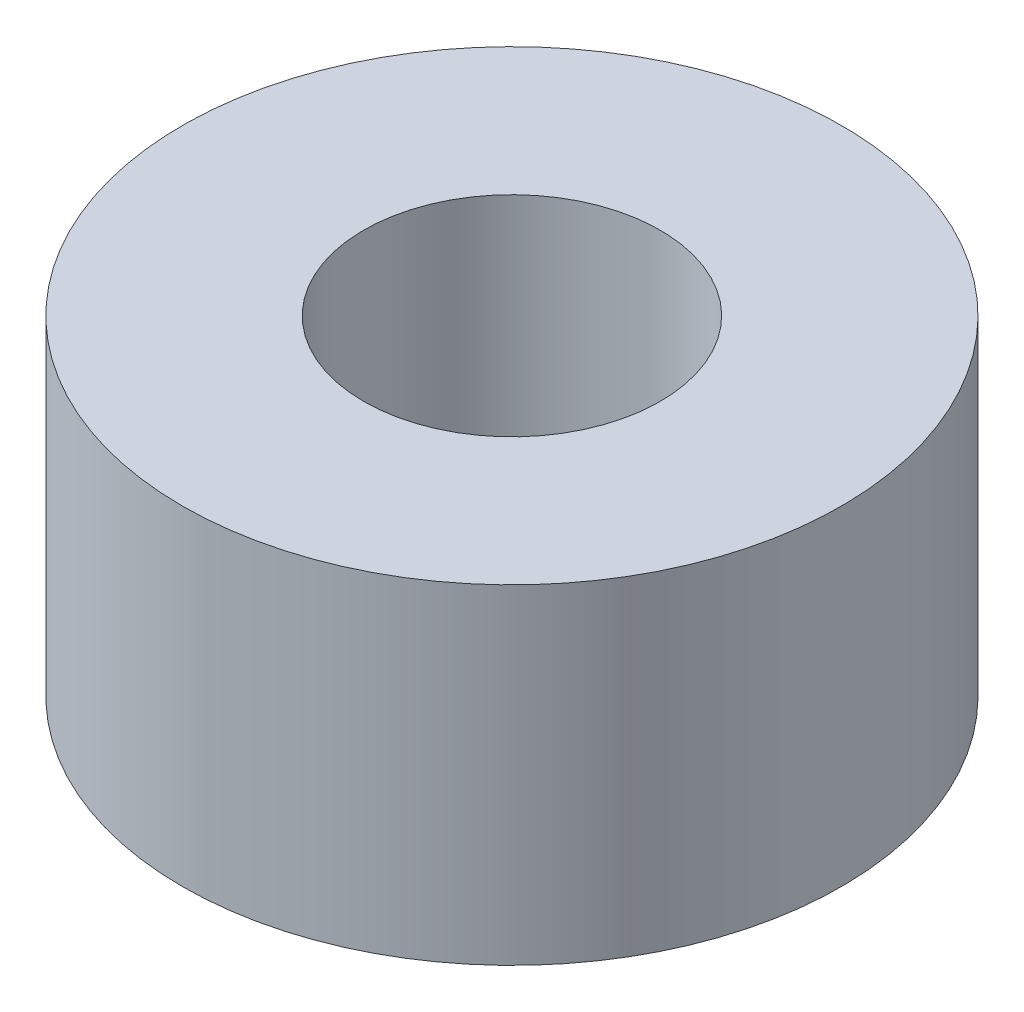
ISO-10303-21;
HEADER;
FILE_DESCRIPTION(('STEP AP214'),'2;1');
FILE_NAME('part.step','',(''),(''),'','','');
FILE_SCHEMA(('AUTOMOTIVE_DESIGN { 1 0 10303 214 1 1 1 1 }'));
ENDSEC;
DATA;
#1=APPLICATION_CONTEXT('core data for automotive mechanical design processes');
#2=APPLICATION_PROTOCOL_DEFINITION('international standard','automotive_design',2000,#1);
#3=PRODUCT_CONTEXT('',#1,'mechanical');
#4=PRODUCT('Part','Part','',(#3));
#5=PRODUCT_RELATED_PRODUCT_CATEGORY('part','',(#4));
#6=PRODUCT_DEFINITION_FORMATION('','',#4);
#7=PRODUCT_DEFINITION_CONTEXT('part definition',#1,'design');
#8=PRODUCT_DEFINITION('design','',#6,#7);
#9=PRODUCT_DEFINITION_SHAPE('','',#8);
#10=(LENGTH_UNIT() NAMED_UNIT(*) SI_UNIT(.MILLI.,.METRE.));
#11=(NAMED_UNIT(*) PLANE_ANGLE_UNIT() SI_UNIT($,.RADIAN.));
#12=(NAMED_UNIT(*) SI_UNIT($,.STERADIAN.) SOLID_ANGLE_UNIT());
#13=UNCERTAINTY_MEASURE_WITH_UNIT(LENGTH_MEASURE(1.E-05),#10,'distance_accuracy_value','');
#14=(GEOMETRIC_REPRESENTATION_CONTEXT(3) GLOBAL_UNCERTAINTY_ASSIGNED_CONTEXT((#13)) GLOBAL_UNIT_ASSIGNED_CONTEXT((#10,
#11,#12)) REPRESENTATION_CONTEXT('',''));
#15=CARTESIAN_POINT('',(0.,0.,0.));
#16=DIRECTION('',(0.,0.,1.));
#17=DIRECTION('',(1.,0.,0.));
#18=AXIS2_PLACEMENT_3D('',#15,#16,#17);
#19=CARTESIAN_POINT('',(0.,4.,0.));
#20=DIRECTION('',(0.,1.,0.));
#21=DIRECTION('',(0.,0.,1.));
#22=AXIS2_PLACEMENT_3D('',#19,#20,#21);
#23=PLANE('',#22);
#24=CARTESIAN_POINT('',(0.,4.,0.));
#25=DIRECTION('',(0.,1.,0.));
#26=DIRECTION('',(0.,0.,1.));
#27=AXIS2_PLACEMENT_3D('',#24,#25,#26);
#28=CIRCLE('',#27,4.);
#29=CARTESIAN_POINT('',(0.,4.,4.));
#30=VERTEX_POINT('',#29);
#31=EDGE_CURVE('E10',#30,#30,#28,.T.);
#32=ORIENTED_EDGE('',*,*,#31,.T.);
#33=EDGE_LOOP('',(#32));
#34=FACE_BOUND('',#33,.T.);
#35=CARTESIAN_POINT('',(0.,4.,0.));
#36=DIRECTION('',(0.,1.,0.));
#37=DIRECTION('',(0.,0.,1.));
#38=AXIS2_PLACEMENT_3D('',#35,#36,#37);
#39=CIRCLE('',#38,1.8);
#40=CARTESIAN_POINT('',(0.,4.,1.8));
#41=VERTEX_POINT('',#40);
#42=EDGE_CURVE('E50',#41,#41,#39,.T.);
#43=ORIENTED_EDGE('',*,*,#42,.F.);
#44=EDGE_LOOP('',(#43));
#45=FACE_BOUND('',#44,.T.);
#46=ADVANCED_FACE('F37',(#34,#45),#23,.T.);
#47=CARTESIAN_POINT('',(0.,0.,0.));
#48=DIRECTION('',(0.,1.,0.));
#49=DIRECTION('',(0.,0.,1.));
#50=AXIS2_PLACEMENT_3D('',#47,#48,#49);
#51=PLANE('',#50);
#52=CARTESIAN_POINT('',(0.,0.,0.));
#53=DIRECTION('',(0.,1.,0.));
#54=DIRECTION('',(0.,0.,1.));
#55=AXIS2_PLACEMENT_3D('',#52,#53,#54);
#56=CIRCLE('',#55,4.);
#57=CARTESIAN_POINT('',(0.,0.,4.));
#58=VERTEX_POINT('',#57);
#59=EDGE_CURVE('E41',#58,#58,#56,.T.);
#60=ORIENTED_EDGE('',*,*,#59,.F.);
#61=EDGE_LOOP('',(#60));
#62=FACE_BOUND('',#61,.T.);
#63=CARTESIAN_POINT('',(0.,0.,0.));
#64=DIRECTION('',(0.,1.,0.));
#65=DIRECTION('',(0.,0.,1.));
#66=AXIS2_PLACEMENT_3D('',#63,#64,#65);
#67=CIRCLE('',#66,1.8);
#68=CARTESIAN_POINT('',(0.,0.,1.8));
#69=VERTEX_POINT('',#68);
#70=EDGE_CURVE('E52',#69,#69,#67,.T.);
#71=ORIENTED_EDGE('',*,*,#70,.T.);
#72=EDGE_LOOP('',(#71));
#73=FACE_BOUND('',#72,.T.);
#74=ADVANCED_FACE('F64',(#62,#73),#51,.F.);
#75=CARTESIAN_POINT('',(0.,4.,0.));
#76=DIRECTION('',(0.,-1.,0.));
#77=DIRECTION('',(0.,0.,-1.));
#78=AXIS2_PLACEMENT_3D('',#75,#76,#77);
#79=CYLINDRICAL_SURFACE('',#78,4.);
#80=ORIENTED_EDGE('',*,*,#31,.F.);
#81=EDGE_LOOP('',(#80));
#82=FACE_BOUND('',#81,.T.);
#83=ORIENTED_EDGE('',*,*,#59,.T.);
#84=EDGE_LOOP('',(#83));
#85=FACE_BOUND('',#84,.T.);
#86=ADVANCED_FACE('F39',(#82,#85),#79,.T.);
#87=CARTESIAN_POINT('',(0.,4.,0.));
#88=DIRECTION('',(0.,-1.,0.));
#89=DIRECTION('',(0.,0.,-1.));
#90=AXIS2_PLACEMENT_3D('',#87,#88,#89);
#91=CYLINDRICAL_SURFACE('',#90,1.8);
#92=ORIENTED_EDGE('',*,*,#42,.T.);
#93=EDGE_LOOP('',(#92));
#94=FACE_BOUND('',#93,.T.);
#95=ORIENTED_EDGE('',*,*,#70,.F.);
#96=EDGE_LOOP('',(#95));
#97=FACE_BOUND('',#96,.T.);
#98=ADVANCED_FACE('F60',(#94,#97),#91,.F.);
#99=CLOSED_SHELL('',(#46,#74,#86,#98));
#100=MANIFOLD_SOLID_BREP('B2',#99);
#101=ADVANCED_BREP_SHAPE_REPRESENTATION('',(#18,#100),#14);
#102=SHAPE_DEFINITION_REPRESENTATION(#9,#101);
ENDSEC;
END-ISO-10303-21;
